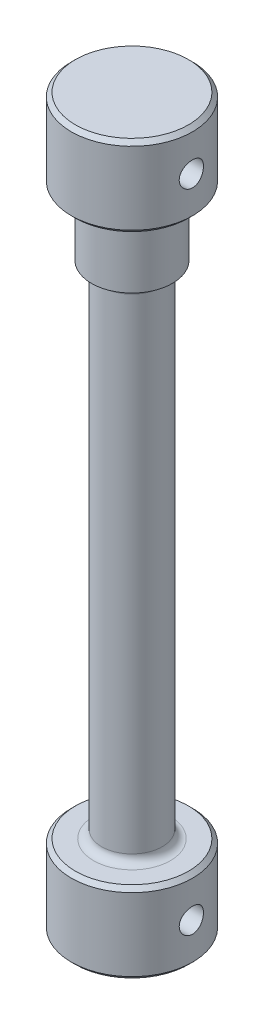
ISO-10303-21;
HEADER;
FILE_DESCRIPTION(('STEP AP214'),'2;1');
FILE_NAME('part.step','',(''),(''),'','','');
FILE_SCHEMA(('AUTOMOTIVE_DESIGN { 1 0 10303 214 1 1 1 1 }'));
ENDSEC;
DATA;
#1=APPLICATION_CONTEXT('core data for automotive mechanical design processes');
#2=APPLICATION_PROTOCOL_DEFINITION('international standard','automotive_design',2000,#1);
#3=PRODUCT_CONTEXT('',#1,'mechanical');
#4=PRODUCT('Part','Part','',(#3));
#5=PRODUCT_RELATED_PRODUCT_CATEGORY('part','',(#4));
#6=PRODUCT_DEFINITION_FORMATION('','',#4);
#7=PRODUCT_DEFINITION_CONTEXT('part definition',#1,'design');
#8=PRODUCT_DEFINITION('design','',#6,#7);
#9=PRODUCT_DEFINITION_SHAPE('','',#8);
#10=(LENGTH_UNIT() NAMED_UNIT(*) SI_UNIT(.MILLI.,.METRE.));
#11=(NAMED_UNIT(*) PLANE_ANGLE_UNIT() SI_UNIT($,.RADIAN.));
#12=(NAMED_UNIT(*) SI_UNIT($,.STERADIAN.) SOLID_ANGLE_UNIT());
#13=UNCERTAINTY_MEASURE_WITH_UNIT(LENGTH_MEASURE(1.E-05),#10,'distance_accuracy_value','');
#14=(GEOMETRIC_REPRESENTATION_CONTEXT(3) GLOBAL_UNCERTAINTY_ASSIGNED_CONTEXT((#13)) GLOBAL_UNIT_ASSIGNED_CONTEXT((#10,
#11,#12)) REPRESENTATION_CONTEXT('',''));
#15=CARTESIAN_POINT('',(0.,0.,0.));
#16=DIRECTION('',(0.,0.,1.));
#17=DIRECTION('',(1.,0.,0.));
#18=AXIS2_PLACEMENT_3D('',#15,#16,#17);
#19=CARTESIAN_POINT('',(0.,0.,0.));
#20=DIRECTION('',(0.,1.,0.));
#21=DIRECTION('',(0.,0.,1.));
#22=AXIS2_PLACEMENT_3D('',#19,#20,#21);
#23=PLANE('',#22);
#24=CARTESIAN_POINT('',(0.,1.2490009027033E-13,0.));
#25=DIRECTION('',(0.,1.,0.));
#26=DIRECTION('',(0.,0.,1.));
#27=AXIS2_PLACEMENT_3D('',#24,#25,#26);
#28=CIRCLE('',#27,14.);
#29=CARTESIAN_POINT('',(0.,1.2490009027033E-13,14.));
#30=VERTEX_POINT('',#29);
#31=EDGE_CURVE('E10',#30,#30,#28,.T.);
#32=ORIENTED_EDGE('',*,*,#31,.T.);
#33=EDGE_LOOP('',(#32));
#34=FACE_BOUND('',#33,.T.);
#35=ADVANCED_FACE('F32',(#34),#23,.T.);
#36=CARTESIAN_POINT('',(0.,1.2490009027033E-13,0.));
#37=DIRECTION('',(0.,-1.,0.));
#38=DIRECTION('',(0.,0.,-1.));
#39=AXIS2_PLACEMENT_3D('',#36,#37,#38);
#40=CONICAL_SURFACE('',#39,14.,0.78539816339745);
#41=CARTESIAN_POINT('',(0.,-0.999999999999873,0.));
#42=DIRECTION('',(0.,1.,0.));
#43=DIRECTION('',(0.,0.,1.));
#44=AXIS2_PLACEMENT_3D('',#41,#42,#43);
#45=CIRCLE('',#44,15.);
#46=CARTESIAN_POINT('',(0.,-0.999999999999873,15.));
#47=VERTEX_POINT('',#46);
#48=EDGE_CURVE('E43',#47,#47,#45,.T.);
#49=ORIENTED_EDGE('',*,*,#48,.T.);
#50=EDGE_LOOP('',(#49));
#51=FACE_BOUND('',#50,.T.);
#52=ORIENTED_EDGE('',*,*,#31,.F.);
#53=EDGE_LOOP('',(#52));
#54=FACE_BOUND('',#53,.T.);
#55=ADVANCED_FACE('F154',(#51,#54),#40,.T.);
#56=CARTESIAN_POINT('',(0.,0.,0.));
#57=DIRECTION('',(0.,1.,0.));
#58=DIRECTION('',(0.,0.,1.));
#59=AXIS2_PLACEMENT_3D('',#56,#57,#58);
#60=CYLINDRICAL_SURFACE('',#59,15.);
#61=CARTESIAN_POINT('',(-14.6969384566991,-10.,-3.));
#62=CARTESIAN_POINT('',(-14.6969417707994,-10.1666931264735,-2.99999383762582));
#63=CARTESIAN_POINT('',(-14.6998052480611,-10.33346387,-2.98605951515444));
#64=CARTESIAN_POINT('',(-14.7109329391462,-10.6622875154294,-2.93073685074853));
#65=CARTESIAN_POINT('',(-14.7192014743436,-10.824336533908,-2.88932654121148));
#66=CARTESIAN_POINT('',(-14.7401662116556,-11.1389119100626,-2.78038734785924));
#67=CARTESIAN_POINT('',(-14.7528580086323,-11.2914475645978,-2.71288444245786));
#68=CARTESIAN_POINT('',(-14.7812339844198,-11.5830245340909,-2.55374732301152));
#69=CARTESIAN_POINT('',(-14.7969179962038,-11.7220666016137,-2.46211445580345));
#70=CARTESIAN_POINT('',(-14.8297589908276,-11.9846830115616,-2.25593722696031));
#71=CARTESIAN_POINT('',(-14.8469321351174,-12.1080387636519,-2.14111696773996));
#72=CARTESIAN_POINT('',(-14.880674169078,-12.333872600737,-1.89242036706393));
#73=CARTESIAN_POINT('',(-14.8972430163249,-12.4363492222516,-1.75854269093396));
#74=CARTESIAN_POINT('',(-14.9280838925269,-12.6183640528854,-1.47408406777277));
#75=CARTESIAN_POINT('',(-14.9423346432465,-12.6976945414499,-1.32336770301663));
#76=CARTESIAN_POINT('',(-14.9667521065089,-12.8298248111444,-1.01041245116182));
#77=CARTESIAN_POINT('',(-14.9769192013236,-12.882627075703,-0.848174644261661));
#78=CARTESIAN_POINT('',(-14.9919096206526,-12.9595215808589,-0.519050319835485));
#79=CARTESIAN_POINT('',(-14.9968015886438,-12.983982932713,-0.352253217644443));
#80=CARTESIAN_POINT('',(-15.0009276355081,-13.004652855515,-0.0168557053126095));
#81=CARTESIAN_POINT('',(-15.0001622595828,-13.0008641489375,0.151744529495529));
#82=CARTESIAN_POINT('',(-14.9931130460555,-12.9654214593533,0.483426002230766));
#83=CARTESIAN_POINT('',(-14.9869079509751,-12.9341650684965,0.646551642895411));
#84=CARTESIAN_POINT('',(-14.9697653147823,-12.8453049026233,0.965194879740904));
#85=CARTESIAN_POINT('',(-14.9588275843212,-12.7877000734244,1.12071217124139));
#86=CARTESIAN_POINT('',(-14.9333188805988,-12.6474098795582,1.42085838960266));
#87=CARTESIAN_POINT('',(-14.9187254452567,-12.5645687466853,1.5654125224017));
#88=CARTESIAN_POINT('',(-14.8875140842136,-12.3762727682902,1.83871513757927));
#89=CARTESIAN_POINT('',(-14.8708959256567,-12.2708153206885,1.967461798575));
#90=CARTESIAN_POINT('',(-14.8371289309338,-12.0380991336746,2.20785429316037));
#91=CARTESIAN_POINT('',(-14.8199758937255,-11.9104924398112,2.3191629497209));
#92=CARTESIAN_POINT('',(-14.7873471479628,-11.6382506726478,2.51885547953042));
#93=CARTESIAN_POINT('',(-14.7718714711364,-11.4936152773504,2.60723891918325));
#94=CARTESIAN_POINT('',(-14.7443414241877,-11.1909375045346,2.75868844440565));
#95=CARTESIAN_POINT('',(-14.7322944469065,-11.032867097081,2.82169994333313));
#96=CARTESIAN_POINT('',(-14.7130942896382,-10.708086028828,2.92017102488275));
#97=CARTESIAN_POINT('',(-14.7059404718528,-10.5413764971428,2.95563419836993));
#98=CARTESIAN_POINT('',(-14.6974643780348,-10.2071054260029,2.99749801810816));
#99=CARTESIAN_POINT('',(-14.6960444117146,-10.039607277069,3.00438557669374));
#100=CARTESIAN_POINT('',(-14.6989345706656,-9.70585533040096,2.99021288493222));
#101=CARTESIAN_POINT('',(-14.7032443710116,-9.53960146264342,2.96915421936733));
#102=CARTESIAN_POINT('',(-14.7170169748474,-9.2146940791233,2.90010662422247));
#103=CARTESIAN_POINT('',(-14.7264299704349,-9.05598297089272,2.8523778625179));
#104=CARTESIAN_POINT('',(-14.7493046805499,-8.74881016291378,2.73162310592556));
#105=CARTESIAN_POINT('',(-14.7627667285881,-8.60034930869285,2.65859502711953));
#106=CARTESIAN_POINT('',(-14.7924421788612,-8.31576067014952,2.4882124266468));
#107=CARTESIAN_POINT('',(-14.8086891559471,-8.17981886109753,2.39055323394826));
#108=CARTESIAN_POINT('',(-14.8420117147991,-7.92607506399726,2.17408671663814));
#109=CARTESIAN_POINT('',(-14.8590873817145,-7.80827494525225,2.05527721543361));
#110=CARTESIAN_POINT('',(-14.8924603760765,-7.59231232244328,1.79769682049367));
#111=CARTESIAN_POINT('',(-14.9087417312605,-7.49447903605002,1.65864749678889));
#112=CARTESIAN_POINT('',(-14.9384138288586,-7.32356235550126,1.36580368990427));
#113=CARTESIAN_POINT('',(-14.9518046926563,-7.25047792196566,1.21200982630052));
#114=CARTESIAN_POINT('',(-14.974118821832,-7.13161338476011,0.894908042472041));
#115=CARTESIAN_POINT('',(-14.9830673742781,-7.08567844532125,0.731660020434237));
#116=CARTESIAN_POINT('',(-14.9955970781298,-7.02192625700847,0.399568364039737));
#117=CARTESIAN_POINT('',(-14.9991788759955,-7.00410562157297,0.230725406133636));
#118=CARTESIAN_POINT('',(-15.0005562136234,-6.99721905711134,-0.104618681710863));
#119=CARTESIAN_POINT('',(-14.9984513564799,-7.00765815863133,-0.271109436424482));
#120=CARTESIAN_POINT('',(-14.9889013068102,-7.05590185164349,-0.59991309394695));
#121=CARTESIAN_POINT('',(-14.9814561814329,-7.0937060990444,-0.762226049261167));
#122=CARTESIAN_POINT('',(-14.9620649509476,-7.19538697627477,-1.07775824923519));
#123=CARTESIAN_POINT('',(-14.9501291174284,-7.25920413439293,-1.23099732972049));
#124=CARTESIAN_POINT('',(-14.9230416637104,-7.41103672399334,-1.52466366055821));
#125=CARTESIAN_POINT('',(-14.9078897894096,-7.49905406771351,-1.66508989730354));
#126=CARTESIAN_POINT('',(-14.8757279747022,-7.69845816118386,-1.93159167031775));
#127=CARTESIAN_POINT('',(-14.858692002537,-7.81019900915133,-2.05739914834453));
#128=CARTESIAN_POINT('',(-14.8248366872359,-8.05315072029632,-2.28864785327552));
#129=CARTESIAN_POINT('',(-14.8080173963616,-8.18436618843978,-2.39408424962675));
#130=CARTESIAN_POINT('',(-14.7763002820179,-8.4642379500713,-2.58267665834995));
#131=CARTESIAN_POINT('',(-14.7614251071368,-8.61306688336377,-2.66558044385427));
#132=CARTESIAN_POINT('',(-14.7355571137924,-8.92279831978031,-2.80507214779868));
#133=CARTESIAN_POINT('',(-14.7245607757495,-9.08368971606158,-2.86168393792249));
#134=CARTESIAN_POINT('',(-14.7098904341354,-9.37078736632863,-2.93600741957297));
#135=CARTESIAN_POINT('',(-14.7050635474382,-9.49535625854188,-2.95996169557106));
#136=CARTESIAN_POINT('',(-14.6985863537725,-9.74660186365341,-2.99196005387913));
#137=CARTESIAN_POINT('',(-14.6969359372925,-9.87327850373341,-3.00000468468793));
#138=CARTESIAN_POINT('',(-14.6969384566991,-10.,-3.));
#139=B_SPLINE_CURVE_WITH_KNOTS('',3,(#61,#62,#63,#64,#65,#66,#67,#68,#69,#70,#71,#72,#73,#74,
#75,#76,#77,#78,#79,#80,#81,#82,#83,#84,#85,#86,#87,#88,#89,#90,#91,#92,#93,#94,#95,#96,#97,#98,
#99,#100,#101,#102,#103,#104,#105,#106,#107,#108,#109,#110,#111,#112,#113,#114,#115,#116,#117,
#118,#119,#120,#121,#122,#123,#124,#125,#126,#127,#128,#129,#130,#131,#132,#133,#134,#135,#136,
#137,#138),.UNSPECIFIED.,.T.,.F.,(4,2,2,2,2,2,2,2,2,2,2,2,2,2,2,2,2,2,2,2,2,2,2,2,2,2,2,2,2,2,2,
2,2,2,2,2,2,2,4),(0.,0.499615391608283,0.999630717852891,1.49914949382176,1.99864039457959,
2.50446757645311,3.01033020106266,3.52060201312351,4.0308260473968,4.53432746649242,
5.03778036348745,5.53406368900613,6.03036687221252,6.52979772666911,7.02928607310199,
7.53748040287451,8.04568434368162,8.55497589518331,9.06420105048075,9.56471273413782,
10.0651960358527,10.5608802534996,11.056605310632,11.5587917932356,12.0610299861063,
12.5709780520035,13.0809046989032,13.5878944073595,14.0948230407489,14.5929305224406,
15.0910317410027,15.5880005122636,16.0850085640405,16.5900345607679,17.0951801666935,
17.6057669573882,18.115889252706,18.4957141091449,18.8755258705644),.UNSPECIFIED.);
#140=CARTESIAN_POINT('',(-14.6969384566991,-10.,-3.));
#141=VERTEX_POINT('',#140);
#142=EDGE_CURVE('E59',#141,#141,#139,.T.);
#143=ORIENTED_EDGE('',*,*,#142,.F.);
#144=EDGE_LOOP('',(#143));
#145=FACE_BOUND('',#144,.T.);
#146=CARTESIAN_POINT('',(14.6969384566991,-10.,-3.));
#147=CARTESIAN_POINT('',(14.6969417707994,-9.83330687352654,-2.99999383762582));
#148=CARTESIAN_POINT('',(14.6998052480611,-9.66653612999999,-2.98605951515444));
#149=CARTESIAN_POINT('',(14.7109329391462,-9.33771248457061,-2.93073685074853));
#150=CARTESIAN_POINT('',(14.7192014743436,-9.17566346609207,-2.88932654121148));
#151=CARTESIAN_POINT('',(14.7401662116556,-8.86108808993738,-2.78038734785924));
#152=CARTESIAN_POINT('',(14.7528580086323,-8.70855243540224,-2.71288444245786));
#153=CARTESIAN_POINT('',(14.7812339844198,-8.41697546590914,-2.55374732301152));
#154=CARTESIAN_POINT('',(14.7969179962038,-8.2779333983863,-2.46211445580345));
#155=CARTESIAN_POINT('',(14.8297589908276,-8.01531698843842,-2.25593722696031));
#156=CARTESIAN_POINT('',(14.8469321351174,-7.89196123634809,-2.14111696773996));
#157=CARTESIAN_POINT('',(14.880674169078,-7.66612739926307,-1.89242036706393));
#158=CARTESIAN_POINT('',(14.8972430163249,-7.56365077774843,-1.75854269093395));
#159=CARTESIAN_POINT('',(14.9280838925269,-7.38163594711463,-1.47408406777277));
#160=CARTESIAN_POINT('',(14.9423346432465,-7.30230545855009,-1.32336770301663));
#161=CARTESIAN_POINT('',(14.9667521065089,-7.1701751888556,-1.01041245116182));
#162=CARTESIAN_POINT('',(14.9769192013236,-7.11737292429704,-0.84817464426166));
#163=CARTESIAN_POINT('',(14.9919096206526,-7.04047841914113,-0.519050319835484));
#164=CARTESIAN_POINT('',(14.9968015886438,-7.01601706728699,-0.352253217644443));
#165=CARTESIAN_POINT('',(15.0009276355081,-6.99534714448506,-0.0168557053126088));
#166=CARTESIAN_POINT('',(15.0001622595828,-6.99913585106254,0.15174452949553));
#167=CARTESIAN_POINT('',(14.9931130460555,-7.03457854064667,0.483426002230767));
#168=CARTESIAN_POINT('',(14.9869079509751,-7.06583493150355,0.646551642895411));
#169=CARTESIAN_POINT('',(14.9697653147823,-7.15469509737668,0.965194879740905));
#170=CARTESIAN_POINT('',(14.9588275843212,-7.21229992657563,1.12071217124139));
#171=CARTESIAN_POINT('',(14.9333188805988,-7.35259012044181,1.42085838960266));
#172=CARTESIAN_POINT('',(14.9187254452567,-7.43543125331467,1.5654125224017));
#173=CARTESIAN_POINT('',(14.8875140842136,-7.62372723170981,1.83871513757927));
#174=CARTESIAN_POINT('',(14.8708959256567,-7.72918467931156,1.967461798575));
#175=CARTESIAN_POINT('',(14.8371289309338,-7.96190086632543,2.20785429316037));
#176=CARTESIAN_POINT('',(14.8199758937255,-8.08950756018878,2.3191629497209));
#177=CARTESIAN_POINT('',(14.7873471479628,-8.36174932735227,2.51885547953043));
#178=CARTESIAN_POINT('',(14.7718714711364,-8.5063847226496,2.60723891918326));
#179=CARTESIAN_POINT('',(14.7443414241877,-8.80906249546543,2.75868844440565));
#180=CARTESIAN_POINT('',(14.7322944469065,-8.967132902919,2.82169994333313));
#181=CARTESIAN_POINT('',(14.7130942896382,-9.29191397117198,2.92017102488275));
#182=CARTESIAN_POINT('',(14.7059404718528,-9.45862350285726,2.95563419836993));
#183=CARTESIAN_POINT('',(14.6974643780348,-9.79289457399715,2.99749801810816));
#184=CARTESIAN_POINT('',(14.6960444117146,-9.96039272293104,3.00438557669374));
#185=CARTESIAN_POINT('',(14.6989345706656,-10.2941446695991,2.99021288493222));
#186=CARTESIAN_POINT('',(14.7032443710116,-10.4603985373566,2.96915421936733));
#187=CARTESIAN_POINT('',(14.7170169748474,-10.7853059208767,2.90010662422247));
#188=CARTESIAN_POINT('',(14.7264299704349,-10.9440170291073,2.8523778625179));
#189=CARTESIAN_POINT('',(14.7493046805499,-11.2511898370862,2.73162310592555));
#190=CARTESIAN_POINT('',(14.7627667285881,-11.3996506913072,2.65859502711953));
#191=CARTESIAN_POINT('',(14.7924421788612,-11.6842393298505,2.4882124266468));
#192=CARTESIAN_POINT('',(14.8086891559471,-11.8201811389025,2.39055323394826));
#193=CARTESIAN_POINT('',(14.8420117147991,-12.0739249360028,2.17408671663814));
#194=CARTESIAN_POINT('',(14.8590873817145,-12.1917250547478,2.05527721543361));
#195=CARTESIAN_POINT('',(14.8924603760765,-12.4076876775567,1.79769682049367));
#196=CARTESIAN_POINT('',(14.9087417312605,-12.50552096395,1.65864749678889));
#197=CARTESIAN_POINT('',(14.9384138288586,-12.6764376444988,1.36580368990427));
#198=CARTESIAN_POINT('',(14.9518046926563,-12.7495220780344,1.21200982630052));
#199=CARTESIAN_POINT('',(14.974118821832,-12.8683866152399,0.894908042472038));
#200=CARTESIAN_POINT('',(14.9830673742781,-12.9143215546788,0.731660020434235));
#201=CARTESIAN_POINT('',(14.9955970781298,-12.9780737429915,0.399568364039734));
#202=CARTESIAN_POINT('',(14.9991788759955,-12.995894378427,0.230725406133634));
#203=CARTESIAN_POINT('',(15.0005562136234,-13.0027809428887,-0.104618681710865));
#204=CARTESIAN_POINT('',(14.9984513564799,-12.9923418413687,-0.271109436424484));
#205=CARTESIAN_POINT('',(14.9889013068102,-12.9440981483565,-0.599913093946952));
#206=CARTESIAN_POINT('',(14.9814561814329,-12.9062939009556,-0.76222604926117));
#207=CARTESIAN_POINT('',(14.9620649509476,-12.8046130237253,-1.0777582492352));
#208=CARTESIAN_POINT('',(14.9501291174284,-12.7407958656071,-1.2309973297205));
#209=CARTESIAN_POINT('',(14.9230416637104,-12.5889632760067,-1.52466366055821));
#210=CARTESIAN_POINT('',(14.9078897894096,-12.5009459322865,-1.66508989730354));
#211=CARTESIAN_POINT('',(14.8757279747022,-12.3015418388162,-1.93159167031775));
#212=CARTESIAN_POINT('',(14.858692002537,-12.1898009908487,-2.05739914834453));
#213=CARTESIAN_POINT('',(14.8248366872359,-11.9468492797037,-2.28864785327553));
#214=CARTESIAN_POINT('',(14.8080173963616,-11.8156338115602,-2.39408424962675));
#215=CARTESIAN_POINT('',(14.7763002820179,-11.5357620499287,-2.58267665834995));
#216=CARTESIAN_POINT('',(14.7614251071368,-11.3869331166362,-2.66558044385427));
#217=CARTESIAN_POINT('',(14.7355571137924,-11.0772016802197,-2.80507214779868));
#218=CARTESIAN_POINT('',(14.7245607757495,-10.9163102839384,-2.86168393792249));
#219=CARTESIAN_POINT('',(14.7098904341354,-10.6292126336714,-2.93600741957297));
#220=CARTESIAN_POINT('',(14.7050635474382,-10.5046437414581,-2.95996169557106));
#221=CARTESIAN_POINT('',(14.6985863537725,-10.2533981363466,-2.99196005387914));
#222=CARTESIAN_POINT('',(14.6969359372925,-10.1267214962666,-3.00000468468793));
#223=CARTESIAN_POINT('',(14.6969384566991,-10.,-3.));
#224=B_SPLINE_CURVE_WITH_KNOTS('',3,(#146,#147,#148,#149,#150,#151,#152,#153,#154,#155,#156,
#157,#158,#159,#160,#161,#162,#163,#164,#165,#166,#167,#168,#169,#170,#171,#172,#173,#174,#175,
#176,#177,#178,#179,#180,#181,#182,#183,#184,#185,#186,#187,#188,#189,#190,#191,#192,#193,#194,
#195,#196,#197,#198,#199,#200,#201,#202,#203,#204,#205,#206,#207,#208,#209,#210,#211,#212,#213,
#214,#215,#216,#217,#218,#219,#220,#221,#222,#223),.UNSPECIFIED.,.T.,.F.,(4,2,2,2,2,2,2,2,2,2,2,
2,2,2,2,2,2,2,2,2,2,2,2,2,2,2,2,2,2,2,2,2,2,2,2,2,2,2,4),(0.,0.499615391608283,
0.999630717852891,1.49914949382176,1.99864039457959,2.50446757645311,3.01033020106266,
3.52060201312351,4.0308260473968,4.53432746649242,5.03778036348745,5.53406368900613,
6.03036687221252,6.52979772666911,7.02928607310199,7.53748040287451,8.04568434368162,
8.55497589518331,9.06420105048075,9.56471273413782,10.0651960358527,10.5608802534996,
11.056605310632,11.5587917932356,12.0610299861063,12.5709780520035,13.0809046989032,
13.5878944073595,14.0948230407489,14.5929305224406,15.0910317410027,15.5880005122636,
16.0850085640405,16.5900345607679,17.0951801666934,17.6057669573882,18.115889252706,
18.4957141091449,18.8755258705644),.UNSPECIFIED.);
#225=CARTESIAN_POINT('',(14.6969384566991,-10.,-3.));
#226=VERTEX_POINT('',#225);
#227=EDGE_CURVE('E52',#226,#226,#224,.T.);
#228=ORIENTED_EDGE('',*,*,#227,.F.);
#229=EDGE_LOOP('',(#228));
#230=FACE_BOUND('',#229,.T.);
#231=CARTESIAN_POINT('',(0.,-18.9999999999999,0.));
#232=DIRECTION('',(0.,1.,0.));
#233=DIRECTION('',(0.,0.,1.));
#234=AXIS2_PLACEMENT_3D('',#231,#232,#233);
#235=CIRCLE('',#234,15.);
#236=CARTESIAN_POINT('',(0.,-18.9999999999999,15.));
#237=VERTEX_POINT('',#236);
#238=EDGE_CURVE('E48',#237,#237,#235,.T.);
#239=ORIENTED_EDGE('',*,*,#238,.T.);
#240=EDGE_LOOP('',(#239));
#241=FACE_BOUND('',#240,.T.);
#242=ORIENTED_EDGE('',*,*,#48,.F.);
#243=EDGE_LOOP('',(#242));
#244=FACE_BOUND('',#243,.T.);
#245=ADVANCED_FACE('F62',(#145,#230,#241,#244),#60,.T.);
#246=CARTESIAN_POINT('',(0.,-18.9999999999999,0.));
#247=DIRECTION('',(0.,1.,0.));
#248=DIRECTION('',(0.,0.,1.));
#249=AXIS2_PLACEMENT_3D('',#246,#247,#248);
#250=CONICAL_SURFACE('',#249,15.,0.785398163397445);
#251=CARTESIAN_POINT('',(0.,-19.9999999999999,0.));
#252=DIRECTION('',(0.,1.,0.));
#253=DIRECTION('',(0.,0.,1.));
#254=AXIS2_PLACEMENT_3D('',#251,#252,#253);
#255=CIRCLE('',#254,14.);
#256=CARTESIAN_POINT('',(0.,-19.9999999999999,14.));
#257=VERTEX_POINT('',#256);
#258=EDGE_CURVE('E136',#257,#257,#255,.T.);
#259=ORIENTED_EDGE('',*,*,#258,.T.);
#260=EDGE_LOOP('',(#259));
#261=FACE_BOUND('',#260,.T.);
#262=ORIENTED_EDGE('',*,*,#238,.F.);
#263=EDGE_LOOP('',(#262));
#264=FACE_BOUND('',#263,.T.);
#265=ADVANCED_FACE('F143',(#261,#264),#250,.T.);
#266=CARTESIAN_POINT('',(-14.,-19.9999999999999,0.));
#267=DIRECTION('',(0.,-1.,0.));
#268=DIRECTION('',(0.,0.,-1.));
#269=AXIS2_PLACEMENT_3D('',#266,#267,#268);
#270=PLANE('',#269);
#271=CARTESIAN_POINT('',(0.,-19.9999999999999,0.));
#272=DIRECTION('',(0.,1.,0.));
#273=DIRECTION('',(0.,0.,1.));
#274=AXIS2_PLACEMENT_3D('',#271,#272,#273);
#275=CIRCLE('',#274,12.);
#276=CARTESIAN_POINT('',(0.,-19.9999999999999,12.));
#277=VERTEX_POINT('',#276);
#278=EDGE_CURVE('E133',#277,#277,#275,.T.);
#279=ORIENTED_EDGE('',*,*,#278,.T.);
#280=EDGE_LOOP('',(#279));
#281=FACE_BOUND('',#280,.T.);
#282=ORIENTED_EDGE('',*,*,#258,.F.);
#283=EDGE_LOOP('',(#282));
#284=FACE_BOUND('',#283,.T.);
#285=ADVANCED_FACE('F145',(#281,#284),#270,.T.);
#286=CARTESIAN_POINT('',(0.,-21.9999999999999,0.));
#287=DIRECTION('',(0.,1.,0.));
#288=DIRECTION('',(0.,0.,1.));
#289=AXIS2_PLACEMENT_3D('',#286,#287,#288);
#290=TOROIDAL_SURFACE('',#289,12.,2.);
#291=CARTESIAN_POINT('',(0.,-21.9999999999999,0.));
#292=DIRECTION('',(0.,1.,0.));
#293=DIRECTION('',(0.,0.,1.));
#294=AXIS2_PLACEMENT_3D('',#291,#292,#293);
#295=CIRCLE('',#294,10.);
#296=CARTESIAN_POINT('',(0.,-21.9999999999999,10.));
#297=VERTEX_POINT('',#296);
#298=EDGE_CURVE('E130',#297,#297,#295,.T.);
#299=ORIENTED_EDGE('',*,*,#298,.T.);
#300=EDGE_LOOP('',(#299));
#301=FACE_BOUND('',#300,.T.);
#302=ORIENTED_EDGE('',*,*,#278,.F.);
#303=EDGE_LOOP('',(#302));
#304=FACE_BOUND('',#303,.T.);
#305=ADVANCED_FACE('F151',(#301,#304),#290,.F.);
#306=CARTESIAN_POINT('',(0.,0.,0.));
#307=DIRECTION('',(0.,1.,0.));
#308=DIRECTION('',(0.,0.,1.));
#309=AXIS2_PLACEMENT_3D('',#306,#307,#308);
#310=CYLINDRICAL_SURFACE('',#309,10.);
#311=CARTESIAN_POINT('',(0.,-35.9999999999999,0.));
#312=DIRECTION('',(0.,1.,0.));
#313=DIRECTION('',(0.,0.,1.));
#314=AXIS2_PLACEMENT_3D('',#311,#312,#313);
#315=CIRCLE('',#314,10.);
#316=CARTESIAN_POINT('',(0.,-35.9999999999999,10.));
#317=VERTEX_POINT('',#316);
#318=EDGE_CURVE('E127',#317,#317,#315,.T.);
#319=ORIENTED_EDGE('',*,*,#318,.T.);
#320=EDGE_LOOP('',(#319));
#321=FACE_BOUND('',#320,.T.);
#322=ORIENTED_EDGE('',*,*,#298,.F.);
#323=EDGE_LOOP('',(#322));
#324=FACE_BOUND('',#323,.T.);
#325=ADVANCED_FACE('F188',(#321,#324),#310,.T.);
#326=CARTESIAN_POINT('',(-10.,-35.9999999999999,0.));
#327=DIRECTION('',(0.,-1.,0.));
#328=DIRECTION('',(0.,0.,-1.));
#329=AXIS2_PLACEMENT_3D('',#326,#327,#328);
#330=PLANE('',#329);
#331=CARTESIAN_POINT('',(0.,-35.9999999999999,0.));
#332=DIRECTION('',(0.,1.,0.));
#333=DIRECTION('',(0.,0.,1.));
#334=AXIS2_PLACEMENT_3D('',#331,#332,#333);
#335=CIRCLE('',#334,9.5);
#336=CARTESIAN_POINT('',(0.,-35.9999999999999,9.5));
#337=VERTEX_POINT('',#336);
#338=EDGE_CURVE('E124',#337,#337,#335,.T.);
#339=ORIENTED_EDGE('',*,*,#338,.T.);
#340=EDGE_LOOP('',(#339));
#341=FACE_BOUND('',#340,.T.);
#342=ORIENTED_EDGE('',*,*,#318,.F.);
#343=EDGE_LOOP('',(#342));
#344=FACE_BOUND('',#343,.T.);
#345=ADVANCED_FACE('F198',(#341,#344),#330,.T.);
#346=CARTESIAN_POINT('',(0.,-37.9999999999999,0.));
#347=DIRECTION('',(0.,1.,0.));
#348=DIRECTION('',(0.,0.,1.));
#349=AXIS2_PLACEMENT_3D('',#346,#347,#348);
#350=TOROIDAL_SURFACE('',#349,9.5,2.);
#351=CARTESIAN_POINT('',(0.,-37.9999999999999,0.));
#352=DIRECTION('',(0.,1.,0.));
#353=DIRECTION('',(0.,0.,1.));
#354=AXIS2_PLACEMENT_3D('',#351,#352,#353);
#355=CIRCLE('',#354,7.5);
#356=CARTESIAN_POINT('',(0.,-37.9999999999999,7.5));
#357=VERTEX_POINT('',#356);
#358=EDGE_CURVE('E121',#357,#357,#355,.T.);
#359=ORIENTED_EDGE('',*,*,#358,.T.);
#360=EDGE_LOOP('',(#359));
#361=FACE_BOUND('',#360,.T.);
#362=ORIENTED_EDGE('',*,*,#338,.F.);
#363=EDGE_LOOP('',(#362));
#364=FACE_BOUND('',#363,.T.);
#365=ADVANCED_FACE('F208',(#361,#364),#350,.F.);
#366=CARTESIAN_POINT('',(0.,0.,0.));
#367=DIRECTION('',(0.,1.,0.));
#368=DIRECTION('',(0.,0.,1.));
#369=AXIS2_PLACEMENT_3D('',#366,#367,#368);
#370=CYLINDRICAL_SURFACE('',#369,7.49999999999999);
#371=CARTESIAN_POINT('',(0.,-158.,0.));
#372=DIRECTION('',(0.,1.,0.));
#373=DIRECTION('',(0.,0.,1.));
#374=AXIS2_PLACEMENT_3D('',#371,#372,#373);
#375=CIRCLE('',#374,7.49999999999998);
#376=CARTESIAN_POINT('',(0.,-158.,7.49999999999998));
#377=VERTEX_POINT('',#376);
#378=EDGE_CURVE('E118',#377,#377,#375,.T.);
#379=ORIENTED_EDGE('',*,*,#378,.T.);
#380=EDGE_LOOP('',(#379));
#381=FACE_BOUND('',#380,.T.);
#382=ORIENTED_EDGE('',*,*,#358,.F.);
#383=EDGE_LOOP('',(#382));
#384=FACE_BOUND('',#383,.T.);
#385=ADVANCED_FACE('F218',(#381,#384),#370,.T.);
#386=CARTESIAN_POINT('',(0.,-158.,0.));
#387=DIRECTION('',(0.,1.,0.));
#388=DIRECTION('',(0.,0.,1.));
#389=AXIS2_PLACEMENT_3D('',#386,#387,#388);
#390=TOROIDAL_SURFACE('',#389,9.49999999999998,2.);
#391=CARTESIAN_POINT('',(0.,-160.,0.));
#392=DIRECTION('',(0.,1.,0.));
#393=DIRECTION('',(0.,0.,1.));
#394=AXIS2_PLACEMENT_3D('',#391,#392,#393);
#395=CIRCLE('',#394,9.49999999999998);
#396=CARTESIAN_POINT('',(0.,-160.,9.49999999999998));
#397=VERTEX_POINT('',#396);
#398=EDGE_CURVE('E110',#397,#397,#395,.T.);
#399=ORIENTED_EDGE('',*,*,#398,.T.);
#400=EDGE_LOOP('',(#399));
#401=FACE_BOUND('',#400,.T.);
#402=ORIENTED_EDGE('',*,*,#378,.F.);
#403=EDGE_LOOP('',(#402));
#404=FACE_BOUND('',#403,.T.);
#405=ADVANCED_FACE('F229',(#401,#404),#390,.F.);
#406=CARTESIAN_POINT('',(-14.,-160.,0.));
#407=DIRECTION('',(0.,1.,0.));
#408=DIRECTION('',(0.,0.,1.));
#409=AXIS2_PLACEMENT_3D('',#406,#407,#408);
#410=PLANE('',#409);
#411=CARTESIAN_POINT('',(0.,-160.,0.));
#412=DIRECTION('',(0.,1.,0.));
#413=DIRECTION('',(0.,0.,1.));
#414=AXIS2_PLACEMENT_3D('',#411,#412,#413);
#415=CIRCLE('',#414,14.);
#416=CARTESIAN_POINT('',(0.,-160.,14.));
#417=VERTEX_POINT('',#416);
#418=EDGE_CURVE('E107',#417,#417,#415,.T.);
#419=ORIENTED_EDGE('',*,*,#418,.T.);
#420=EDGE_LOOP('',(#419));
#421=FACE_BOUND('',#420,.T.);
#422=ORIENTED_EDGE('',*,*,#398,.F.);
#423=EDGE_LOOP('',(#422));
#424=FACE_BOUND('',#423,.T.);
#425=ADVANCED_FACE('F239',(#421,#424),#410,.T.);
#426=CARTESIAN_POINT('',(0.,-160.,0.));
#427=DIRECTION('',(0.,-1.,0.));
#428=DIRECTION('',(0.,0.,-1.));
#429=AXIS2_PLACEMENT_3D('',#426,#427,#428);
#430=CONICAL_SURFACE('',#429,14.,0.785398163397459);
#431=CARTESIAN_POINT('',(0.,-161.,0.));
#432=DIRECTION('',(0.,1.,0.));
#433=DIRECTION('',(0.,0.,1.));
#434=AXIS2_PLACEMENT_3D('',#431,#432,#433);
#435=CIRCLE('',#434,15.);
#436=CARTESIAN_POINT('',(0.,-161.,15.));
#437=VERTEX_POINT('',#436);
#438=EDGE_CURVE('E105',#437,#437,#435,.T.);
#439=ORIENTED_EDGE('',*,*,#438,.T.);
#440=EDGE_LOOP('',(#439));
#441=FACE_BOUND('',#440,.T.);
#442=ORIENTED_EDGE('',*,*,#418,.F.);
#443=EDGE_LOOP('',(#442));
#444=FACE_BOUND('',#443,.T.);
#445=ADVANCED_FACE('F84',(#441,#444),#430,.T.);
#446=CARTESIAN_POINT('',(0.,0.,0.));
#447=DIRECTION('',(0.,1.,0.));
#448=DIRECTION('',(0.,0.,1.));
#449=AXIS2_PLACEMENT_3D('',#446,#447,#448);
#450=CYLINDRICAL_SURFACE('',#449,15.);
#451=CARTESIAN_POINT('',(-14.6969384566991,-170.,-3.));
#452=CARTESIAN_POINT('',(-14.6969417707994,-170.166693126474,-2.99999383762582));
#453=CARTESIAN_POINT('',(-14.6998052480611,-170.33346387,-2.98605951515444));
#454=CARTESIAN_POINT('',(-14.7109329391462,-170.66228751543,-2.93073685074853));
#455=CARTESIAN_POINT('',(-14.7192014743436,-170.824336533908,-2.88932654121149));
#456=CARTESIAN_POINT('',(-14.7401662116556,-171.138911910063,-2.78038734785924));
#457=CARTESIAN_POINT('',(-14.7528580086323,-171.291447564598,-2.71288444245787));
#458=CARTESIAN_POINT('',(-14.7812339844197,-171.583024534091,-2.55374732301152));
#459=CARTESIAN_POINT('',(-14.7969179962038,-171.722066601614,-2.46211445580346));
#460=CARTESIAN_POINT('',(-14.8297589908276,-171.984683011562,-2.25593722696032));
#461=CARTESIAN_POINT('',(-14.8469321351174,-172.108038763652,-2.14111696773997));
#462=CARTESIAN_POINT('',(-14.880674169078,-172.333872600737,-1.89242036706394));
#463=CARTESIAN_POINT('',(-14.8972430163249,-172.436349222252,-1.75854269093397));
#464=CARTESIAN_POINT('',(-14.9280838925269,-172.618364052886,-1.47408406777278));
#465=CARTESIAN_POINT('',(-14.9423346432465,-172.69769454145,-1.32336770301664));
#466=CARTESIAN_POINT('',(-14.9667521065089,-172.829824811145,-1.01041245116182));
#467=CARTESIAN_POINT('',(-14.9769192013236,-172.882627075703,-0.848174644261662));
#468=CARTESIAN_POINT('',(-14.9919096206526,-172.959521580859,-0.519050319835483));
#469=CARTESIAN_POINT('',(-14.9968015886438,-172.983982932713,-0.352253217644442));
#470=CARTESIAN_POINT('',(-15.0009276355081,-173.004652855515,-0.0168557053126104));
#471=CARTESIAN_POINT('',(-15.0001622595828,-173.000864148938,0.151744529495527));
#472=CARTESIAN_POINT('',(-14.9931130460555,-172.965421459354,0.483426002230762));
#473=CARTESIAN_POINT('',(-14.9869079509751,-172.934165068497,0.646551642895406));
#474=CARTESIAN_POINT('',(-14.9697653147823,-172.845304902623,0.965194879740899));
#475=CARTESIAN_POINT('',(-14.9588275843212,-172.787700073425,1.12071217124138));
#476=CARTESIAN_POINT('',(-14.9333188805988,-172.647409879558,1.42085838960266));
#477=CARTESIAN_POINT('',(-14.9187254452567,-172.564568746686,1.56541252240169));
#478=CARTESIAN_POINT('',(-14.8875140842136,-172.37627276829,1.83871513757926));
#479=CARTESIAN_POINT('',(-14.8708959256567,-172.270815320689,1.967461798575));
#480=CARTESIAN_POINT('',(-14.8371289309338,-172.038099133675,2.20785429316037));
#481=CARTESIAN_POINT('',(-14.8199758937255,-171.910492439811,2.31916294972088));
#482=CARTESIAN_POINT('',(-14.7873471479628,-171.638250672648,2.51885547953041));
#483=CARTESIAN_POINT('',(-14.7718714711364,-171.493615277351,2.60723891918325));
#484=CARTESIAN_POINT('',(-14.7443414241877,-171.190937504535,2.75868844440564));
#485=CARTESIAN_POINT('',(-14.7322944469065,-171.032867097081,2.82169994333312));
#486=CARTESIAN_POINT('',(-14.7130942896382,-170.708086028828,2.92017102488274));
#487=CARTESIAN_POINT('',(-14.7059404718528,-170.541376497143,2.95563419836992));
#488=CARTESIAN_POINT('',(-14.6974643780348,-170.207105426003,2.99749801810816));
#489=CARTESIAN_POINT('',(-14.6960444117146,-170.039607277069,3.00438557669374));
#490=CARTESIAN_POINT('',(-14.6989345706656,-169.705855330401,2.99021288493222));
#491=CARTESIAN_POINT('',(-14.7032443710116,-169.539601462644,2.96915421936733));
#492=CARTESIAN_POINT('',(-14.7170169748474,-169.214694079123,2.90010662422248));
#493=CARTESIAN_POINT('',(-14.7264299704349,-169.055982970893,2.85237786251791));
#494=CARTESIAN_POINT('',(-14.7493046805499,-168.748810162914,2.73162310592557));
#495=CARTESIAN_POINT('',(-14.7627667285881,-168.600349308693,2.65859502711954));
#496=CARTESIAN_POINT('',(-14.7924421788612,-168.31576067015,2.4882124266468));
#497=CARTESIAN_POINT('',(-14.8086891559471,-168.179818861098,2.39055323394826));
#498=CARTESIAN_POINT('',(-14.8420117147991,-167.926075063997,2.17408671663814));
#499=CARTESIAN_POINT('',(-14.8590873817145,-167.808274945252,2.05527721543362));
#500=CARTESIAN_POINT('',(-14.8924603760765,-167.592312322443,1.79769682049368));
#501=CARTESIAN_POINT('',(-14.9087417312605,-167.49447903605,1.6586474967889));
#502=CARTESIAN_POINT('',(-14.9384138288586,-167.323562355501,1.36580368990427));
#503=CARTESIAN_POINT('',(-14.9518046926563,-167.250477921966,1.21200982630052));
#504=CARTESIAN_POINT('',(-14.974118821832,-167.13161338476,0.894908042472036));
#505=CARTESIAN_POINT('',(-14.9830673742781,-167.085678445321,0.731660020434233));
#506=CARTESIAN_POINT('',(-14.9955970781298,-167.021926257009,0.399568364039737));
#507=CARTESIAN_POINT('',(-14.9991788759955,-167.004105621573,0.23072540613364));
#508=CARTESIAN_POINT('',(-15.0005562136234,-166.997219057111,-0.104618681710857));
#509=CARTESIAN_POINT('',(-14.9984513564799,-167.007658158632,-0.271109436424476));
#510=CARTESIAN_POINT('',(-14.9889013068102,-167.055901851644,-0.599913093946943));
#511=CARTESIAN_POINT('',(-14.9814561814329,-167.093706099045,-0.762226049261159));
#512=CARTESIAN_POINT('',(-14.9620649509476,-167.195386976275,-1.07775824923519));
#513=CARTESIAN_POINT('',(-14.9501291174284,-167.259204134393,-1.2309973297205));
#514=CARTESIAN_POINT('',(-14.9230416637104,-167.411036723993,-1.52466366055821));
#515=CARTESIAN_POINT('',(-14.9078897894096,-167.499054067714,-1.66508989730353));
#516=CARTESIAN_POINT('',(-14.8757279747022,-167.698458161184,-1.93159167031774));
#517=CARTESIAN_POINT('',(-14.858692002537,-167.810199009151,-2.05739914834453));
#518=CARTESIAN_POINT('',(-14.8248366872359,-168.053150720296,-2.28864785327552));
#519=CARTESIAN_POINT('',(-14.8080173963616,-168.18436618844,-2.39408424962674));
#520=CARTESIAN_POINT('',(-14.7763002820179,-168.464237950071,-2.58267665834994));
#521=CARTESIAN_POINT('',(-14.7614251071368,-168.613066883364,-2.66558044385427));
#522=CARTESIAN_POINT('',(-14.7355571137924,-168.92279831978,-2.80507214779868));
#523=CARTESIAN_POINT('',(-14.7245607757495,-169.083689716062,-2.86168393792249));
#524=CARTESIAN_POINT('',(-14.7098904341354,-169.370787366329,-2.93600741957297));
#525=CARTESIAN_POINT('',(-14.7050635474382,-169.495356258542,-2.95996169557105));
#526=CARTESIAN_POINT('',(-14.6985863537725,-169.746601863654,-2.99196005387914));
#527=CARTESIAN_POINT('',(-14.6969359372925,-169.873278503734,-3.00000468468793));
#528=CARTESIAN_POINT('',(-14.6969384566991,-170.,-3.));
#529=B_SPLINE_CURVE_WITH_KNOTS('',3,(#451,#452,#453,#454,#455,#456,#457,#458,#459,#460,#461,
#462,#463,#464,#465,#466,#467,#468,#469,#470,#471,#472,#473,#474,#475,#476,#477,#478,#479,#480,
#481,#482,#483,#484,#485,#486,#487,#488,#489,#490,#491,#492,#493,#494,#495,#496,#497,#498,#499,
#500,#501,#502,#503,#504,#505,#506,#507,#508,#509,#510,#511,#512,#513,#514,#515,#516,#517,#518,
#519,#520,#521,#522,#523,#524,#525,#526,#527,#528),.UNSPECIFIED.,.T.,.F.,(4,2,2,2,2,2,2,2,2,2,2,
2,2,2,2,2,2,2,2,2,2,2,2,2,2,2,2,2,2,2,2,2,2,2,2,2,2,2,4),(0.,0.499615391608241,
0.999630717852883,1.49914949382177,1.99864039457956,2.50446757645308,3.01033020106264,
3.52060201312351,4.0308260473968,4.53432746649242,5.03778036348745,5.53406368900612,
6.03036687221251,6.5297977266691,7.02928607310198,7.53748040287448,8.04568434368159,
8.55497589518325,9.06420105048072,9.56471273413781,10.0651960358526,10.5608802534996,
11.056605310632,11.5587917932356,12.0610299861063,12.5709780520035,13.0809046989032,
13.5878944073595,14.0948230407488,14.5929305224406,15.0910317410027,15.5880005122636,
16.0850085640405,16.5900345607679,17.0951801666935,17.6057669573882,18.1158892527059,
18.4957141091448,18.8755258705644),.UNSPECIFIED.);
#530=CARTESIAN_POINT('',(-14.6969384566991,-170.,-3.));
#531=VERTEX_POINT('',#530);
#532=EDGE_CURVE('E35',#531,#531,#529,.T.);
#533=ORIENTED_EDGE('',*,*,#532,.F.);
#534=EDGE_LOOP('',(#533));
#535=FACE_BOUND('',#534,.T.);
#536=CARTESIAN_POINT('',(14.6969384566991,-170.,-3.));
#537=CARTESIAN_POINT('',(14.6969417707994,-169.833306873527,-2.99999383762582));
#538=CARTESIAN_POINT('',(14.6998052480611,-169.66653613,-2.98605951515444));
#539=CARTESIAN_POINT('',(14.7109329391462,-169.337712484571,-2.93073685074853));
#540=CARTESIAN_POINT('',(14.7192014743436,-169.175663466092,-2.88932654121149));
#541=CARTESIAN_POINT('',(14.7401662116556,-168.861088089938,-2.78038734785924));
#542=CARTESIAN_POINT('',(14.7528580086323,-168.708552435402,-2.71288444245787));
#543=CARTESIAN_POINT('',(14.7812339844197,-168.416975465909,-2.55374732301152));
#544=CARTESIAN_POINT('',(14.7969179962038,-168.277933398386,-2.46211445580346));
#545=CARTESIAN_POINT('',(14.8297589908276,-168.015316988439,-2.25593722696032));
#546=CARTESIAN_POINT('',(14.8469321351174,-167.891961236348,-2.14111696773997));
#547=CARTESIAN_POINT('',(14.880674169078,-167.666127399263,-1.89242036706394));
#548=CARTESIAN_POINT('',(14.8972430163249,-167.563650777749,-1.75854269093397));
#549=CARTESIAN_POINT('',(14.9280838925269,-167.381635947115,-1.47408406777278));
#550=CARTESIAN_POINT('',(14.9423346432465,-167.30230545855,-1.32336770301664));
#551=CARTESIAN_POINT('',(14.9667521065089,-167.170175188856,-1.01041245116182));
#552=CARTESIAN_POINT('',(14.9769192013236,-167.117372924297,-0.848174644261662));
#553=CARTESIAN_POINT('',(14.9919096206526,-167.040478419141,-0.519050319835482));
#554=CARTESIAN_POINT('',(14.9968015886438,-167.016017067287,-0.352253217644441));
#555=CARTESIAN_POINT('',(15.0009276355081,-166.995347144485,-0.0168557053126093));
#556=CARTESIAN_POINT('',(15.0001622595828,-166.999135851063,0.151744529495527));
#557=CARTESIAN_POINT('',(14.9931130460555,-167.034578540647,0.483426002230762));
#558=CARTESIAN_POINT('',(14.9869079509751,-167.065834931504,0.646551642895406));
#559=CARTESIAN_POINT('',(14.9697653147823,-167.154695097377,0.965194879740899));
#560=CARTESIAN_POINT('',(14.9588275843212,-167.212299926576,1.12071217124138));
#561=CARTESIAN_POINT('',(14.9333188805988,-167.352590120442,1.42085838960266));
#562=CARTESIAN_POINT('',(14.9187254452567,-167.435431253315,1.56541252240169));
#563=CARTESIAN_POINT('',(14.8875140842136,-167.62372723171,1.83871513757926));
#564=CARTESIAN_POINT('',(14.8708959256567,-167.729184679312,1.967461798575));
#565=CARTESIAN_POINT('',(14.8371289309338,-167.961900866326,2.20785429316037));
#566=CARTESIAN_POINT('',(14.8199758937255,-168.089507560189,2.31916294972088));
#567=CARTESIAN_POINT('',(14.7873471479628,-168.361749327352,2.51885547953041));
#568=CARTESIAN_POINT('',(14.7718714711364,-168.50638472265,2.60723891918325));
#569=CARTESIAN_POINT('',(14.7443414241877,-168.809062495466,2.75868844440565));
#570=CARTESIAN_POINT('',(14.7322944469065,-168.967132902919,2.82169994333313));
#571=CARTESIAN_POINT('',(14.7130942896382,-169.291913971172,2.92017102488275));
#572=CARTESIAN_POINT('',(14.7059404718528,-169.458623502857,2.95563419836993));
#573=CARTESIAN_POINT('',(14.6974643780348,-169.792894573997,2.99749801810815));
#574=CARTESIAN_POINT('',(14.6960444117146,-169.960392722931,3.00438557669374));
#575=CARTESIAN_POINT('',(14.6989345706656,-170.294144669599,2.99021288493222));
#576=CARTESIAN_POINT('',(14.7032443710116,-170.460398537357,2.96915421936733));
#577=CARTESIAN_POINT('',(14.7170169748474,-170.785305920877,2.90010662422248));
#578=CARTESIAN_POINT('',(14.7264299704349,-170.944017029107,2.85237786251791));
#579=CARTESIAN_POINT('',(14.7493046805499,-171.251189837086,2.73162310592557));
#580=CARTESIAN_POINT('',(14.7627667285881,-171.399650691307,2.65859502711954));
#581=CARTESIAN_POINT('',(14.7924421788612,-171.684239329851,2.4882124266468));
#582=CARTESIAN_POINT('',(14.8086891559471,-171.820181138903,2.39055323394826));
#583=CARTESIAN_POINT('',(14.8420117147991,-172.073924936003,2.17408671663814));
#584=CARTESIAN_POINT('',(14.8590873817145,-172.191725054748,2.05527721543362));
#585=CARTESIAN_POINT('',(14.8924603760765,-172.407687677557,1.79769682049368));
#586=CARTESIAN_POINT('',(14.9087417312605,-172.50552096395,1.65864749678889));
#587=CARTESIAN_POINT('',(14.9384138288586,-172.676437644499,1.36580368990426));
#588=CARTESIAN_POINT('',(14.9518046926563,-172.749522078035,1.21200982630052));
#589=CARTESIAN_POINT('',(14.974118821832,-172.86838661524,0.894908042472038));
#590=CARTESIAN_POINT('',(14.9830673742781,-172.914321554679,0.731660020434237));
#591=CARTESIAN_POINT('',(14.9955970781298,-172.978073742992,0.39956836403974));
#592=CARTESIAN_POINT('',(14.9991788759955,-172.995894378427,0.230725406133642));
#593=CARTESIAN_POINT('',(15.0005562136234,-173.002780942889,-0.104618681710857));
#594=CARTESIAN_POINT('',(14.9984513564799,-172.992341841369,-0.271109436424476));
#595=CARTESIAN_POINT('',(14.9889013068102,-172.944098148357,-0.599913093946943));
#596=CARTESIAN_POINT('',(14.9814561814329,-172.906293900956,-0.762226049261159));
#597=CARTESIAN_POINT('',(14.9620649509476,-172.804613023725,-1.07775824923519));
#598=CARTESIAN_POINT('',(14.9501291174284,-172.740795865607,-1.2309973297205));
#599=CARTESIAN_POINT('',(14.9230416637104,-172.588963276007,-1.52466366055821));
#600=CARTESIAN_POINT('',(14.9078897894096,-172.500945932287,-1.66508989730353));
#601=CARTESIAN_POINT('',(14.8757279747022,-172.301541838816,-1.93159167031774));
#602=CARTESIAN_POINT('',(14.858692002537,-172.189800990849,-2.05739914834454));
#603=CARTESIAN_POINT('',(14.8248366872359,-171.946849279704,-2.28864785327553));
#604=CARTESIAN_POINT('',(14.8080173963616,-171.81563381156,-2.39408424962674));
#605=CARTESIAN_POINT('',(14.7763002820179,-171.535762049929,-2.58267665834994));
#606=CARTESIAN_POINT('',(14.7614251071368,-171.386933116636,-2.66558044385426));
#607=CARTESIAN_POINT('',(14.7355571137924,-171.07720168022,-2.80507214779868));
#608=CARTESIAN_POINT('',(14.7245607757495,-170.916310283939,-2.86168393792248));
#609=CARTESIAN_POINT('',(14.7098904341354,-170.629212633672,-2.93600741957297));
#610=CARTESIAN_POINT('',(14.7050635474382,-170.504643741458,-2.95996169557105));
#611=CARTESIAN_POINT('',(14.6985863537725,-170.253398136347,-2.99196005387914));
#612=CARTESIAN_POINT('',(14.6969359372925,-170.126721496267,-3.00000468468793));
#613=CARTESIAN_POINT('',(14.6969384566991,-170.,-3.));
#614=B_SPLINE_CURVE_WITH_KNOTS('',3,(#536,#537,#538,#539,#540,#541,#542,#543,#544,#545,#546,
#547,#548,#549,#550,#551,#552,#553,#554,#555,#556,#557,#558,#559,#560,#561,#562,#563,#564,#565,
#566,#567,#568,#569,#570,#571,#572,#573,#574,#575,#576,#577,#578,#579,#580,#581,#582,#583,#584,
#585,#586,#587,#588,#589,#590,#591,#592,#593,#594,#595,#596,#597,#598,#599,#600,#601,#602,#603,
#604,#605,#606,#607,#608,#609,#610,#611,#612,#613),.UNSPECIFIED.,.T.,.F.,(4,2,2,2,2,2,2,2,2,2,2,
2,2,2,2,2,2,2,2,2,2,2,2,2,2,2,2,2,2,2,2,2,2,2,2,2,2,2,4),(0.,0.499615391608241,
0.999630717852883,1.49914949382177,1.99864039457956,2.50446757645308,3.01033020106264,
3.52060201312351,4.0308260473968,4.53432746649242,5.03778036348745,5.53406368900612,
6.03036687221251,6.5297977266691,7.02928607310198,7.53748040287448,8.04568434368159,
8.55497589518331,9.06420105048072,9.56471273413778,10.0651960358526,10.5608802534996,
11.056605310632,11.5587917932356,12.0610299861063,12.5709780520035,13.0809046989032,
13.5878944073595,14.0948230407488,14.5929305224406,15.0910317410027,15.5880005122636,
16.0850085640405,16.5900345607679,17.0951801666934,17.6057669573882,18.1158892527059,
18.4957141091448,18.8755258705644),.UNSPECIFIED.);
#615=CARTESIAN_POINT('',(14.6969384566991,-170.,-3.));
#616=VERTEX_POINT('',#615);
#617=EDGE_CURVE('E88',#616,#616,#614,.T.);
#618=ORIENTED_EDGE('',*,*,#617,.F.);
#619=EDGE_LOOP('',(#618));
#620=FACE_BOUND('',#619,.T.);
#621=CARTESIAN_POINT('',(0.,-179.,0.));
#622=DIRECTION('',(0.,1.,0.));
#623=DIRECTION('',(0.,0.,1.));
#624=AXIS2_PLACEMENT_3D('',#621,#622,#623);
#625=CIRCLE('',#624,15.);
#626=CARTESIAN_POINT('',(0.,-179.,15.));
#627=VERTEX_POINT('',#626);
#628=EDGE_CURVE('E102',#627,#627,#625,.T.);
#629=ORIENTED_EDGE('',*,*,#628,.T.);
#630=EDGE_LOOP('',(#629));
#631=FACE_BOUND('',#630,.T.);
#632=ORIENTED_EDGE('',*,*,#438,.F.);
#633=EDGE_LOOP('',(#632));
#634=FACE_BOUND('',#633,.T.);
#635=ADVANCED_FACE('F79',(#535,#620,#631,#634),#450,.T.);
#636=CARTESIAN_POINT('',(0.,-179.,0.));
#637=DIRECTION('',(0.,1.,0.));
#638=DIRECTION('',(0.,0.,1.));
#639=AXIS2_PLACEMENT_3D('',#636,#637,#638);
#640=CONICAL_SURFACE('',#639,15.,0.785398163397448);
#641=CARTESIAN_POINT('',(0.,-180.,0.));
#642=DIRECTION('',(0.,1.,0.));
#643=DIRECTION('',(0.,0.,1.));
#644=AXIS2_PLACEMENT_3D('',#641,#642,#643);
#645=CIRCLE('',#644,14.);
#646=CARTESIAN_POINT('',(0.,-180.,14.));
#647=VERTEX_POINT('',#646);
#648=EDGE_CURVE('E112',#647,#647,#645,.T.);
#649=ORIENTED_EDGE('',*,*,#648,.T.);
#650=EDGE_LOOP('',(#649));
#651=FACE_BOUND('',#650,.T.);
#652=ORIENTED_EDGE('',*,*,#628,.F.);
#653=EDGE_LOOP('',(#652));
#654=FACE_BOUND('',#653,.T.);
#655=ADVANCED_FACE('F76',(#651,#654),#640,.T.);
#656=CARTESIAN_POINT('',(0.,-180.,0.));
#657=DIRECTION('',(0.,-1.,0.));
#658=DIRECTION('',(0.,0.,-1.));
#659=AXIS2_PLACEMENT_3D('',#656,#657,#658);
#660=PLANE('',#659);
#661=ORIENTED_EDGE('',*,*,#648,.F.);
#662=EDGE_LOOP('',(#661));
#663=FACE_BOUND('',#662,.T.);
#664=ADVANCED_FACE('F70',(#663),#660,.T.);
#665=CARTESIAN_POINT('',(-25.,-10.,0.));
#666=DIRECTION('',(1.,0.,0.));
#667=DIRECTION('',(0.,0.,-1.));
#668=AXIS2_PLACEMENT_3D('',#665,#666,#667);
#669=CYLINDRICAL_SURFACE('',#668,3.);
#670=ORIENTED_EDGE('',*,*,#142,.T.);
#671=EDGE_LOOP('',(#670));
#672=FACE_BOUND('',#671,.T.);
#673=ORIENTED_EDGE('',*,*,#227,.T.);
#674=EDGE_LOOP('',(#673));
#675=FACE_BOUND('',#674,.T.);
#676=ADVANCED_FACE('F65',(#672,#675),#669,.F.);
#677=CARTESIAN_POINT('',(-25.,-170.,0.));
#678=DIRECTION('',(1.,0.,0.));
#679=DIRECTION('',(0.,0.,-1.));
#680=AXIS2_PLACEMENT_3D('',#677,#678,#679);
#681=CYLINDRICAL_SURFACE('',#680,3.);
#682=ORIENTED_EDGE('',*,*,#532,.T.);
#683=EDGE_LOOP('',(#682));
#684=FACE_BOUND('',#683,.T.);
#685=ORIENTED_EDGE('',*,*,#617,.T.);
#686=EDGE_LOOP('',(#685));
#687=FACE_BOUND('',#686,.T.);
#688=ADVANCED_FACE('F69',(#684,#687),#681,.F.);
#689=CLOSED_SHELL('',(#35,#55,#245,#265,#285,#305,#325,#345,#365,#385,#405,#425,#445,#635,#655,
#664,#676,#688));
#690=MANIFOLD_SOLID_BREP('B2',#689);
#691=ADVANCED_BREP_SHAPE_REPRESENTATION('',(#18,#690),#14);
#692=SHAPE_DEFINITION_REPRESENTATION(#9,#691);
ENDSEC;
END-ISO-10303-21;
